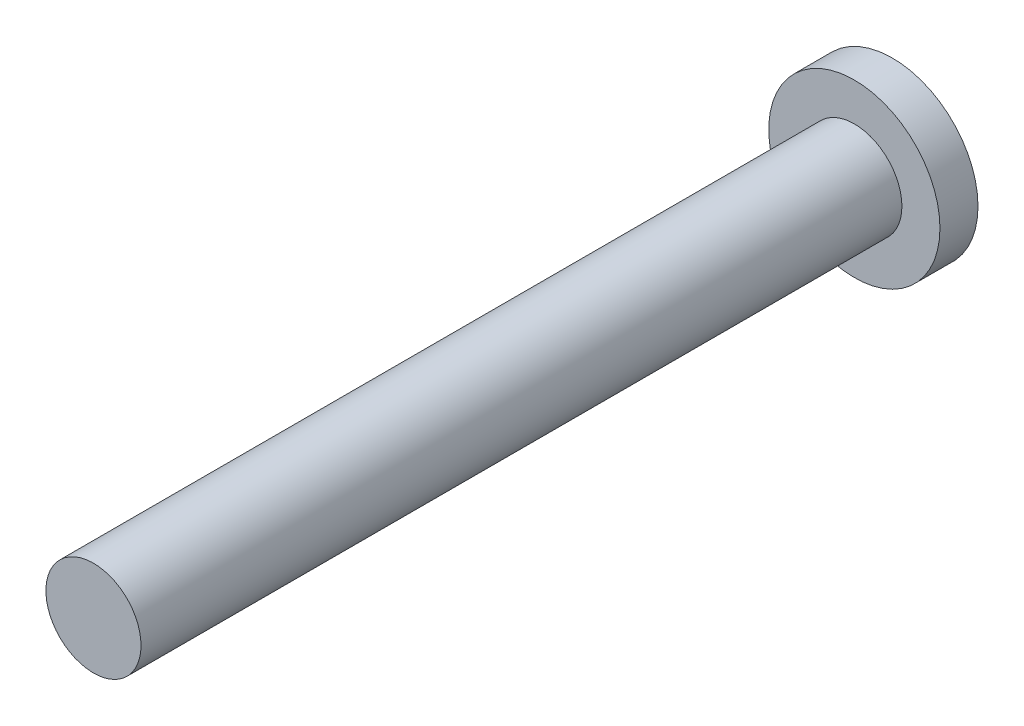
ISO-10303-21;
HEADER;
FILE_DESCRIPTION(('STEP AP214'),'2;1');
FILE_NAME('part.step','',(''),(''),'','','');
FILE_SCHEMA(('AUTOMOTIVE_DESIGN { 1 0 10303 214 1 1 1 1 }'));
ENDSEC;
DATA;
#1=APPLICATION_CONTEXT('core data for automotive mechanical design processes');
#2=APPLICATION_PROTOCOL_DEFINITION('international standard','automotive_design',2000,#1);
#3=PRODUCT_CONTEXT('',#1,'mechanical');
#4=PRODUCT('Part','Part','',(#3));
#5=PRODUCT_RELATED_PRODUCT_CATEGORY('part','',(#4));
#6=PRODUCT_DEFINITION_FORMATION('','',#4);
#7=PRODUCT_DEFINITION_CONTEXT('part definition',#1,'design');
#8=PRODUCT_DEFINITION('design','',#6,#7);
#9=PRODUCT_DEFINITION_SHAPE('','',#8);
#10=(LENGTH_UNIT() NAMED_UNIT(*) SI_UNIT(.MILLI.,.METRE.));
#11=(NAMED_UNIT(*) PLANE_ANGLE_UNIT() SI_UNIT($,.RADIAN.));
#12=(NAMED_UNIT(*) SI_UNIT($,.STERADIAN.) SOLID_ANGLE_UNIT());
#13=UNCERTAINTY_MEASURE_WITH_UNIT(LENGTH_MEASURE(1.E-05),#10,'distance_accuracy_value','');
#14=(GEOMETRIC_REPRESENTATION_CONTEXT(3) GLOBAL_UNCERTAINTY_ASSIGNED_CONTEXT((#13)) GLOBAL_UNIT_ASSIGNED_CONTEXT((#10,
#11,#12)) REPRESENTATION_CONTEXT('',''));
#15=CARTESIAN_POINT('',(0.,0.,0.));
#16=DIRECTION('',(0.,0.,1.));
#17=DIRECTION('',(1.,0.,0.));
#18=AXIS2_PLACEMENT_3D('',#15,#16,#17);
#19=CARTESIAN_POINT('',(0.,0.,-40.));
#20=DIRECTION('',(0.,0.,1.));
#21=DIRECTION('',(-1.,0.,0.));
#22=AXIS2_PLACEMENT_3D('',#19,#20,#21);
#23=CYLINDRICAL_SURFACE('',#22,2.5);
#24=CARTESIAN_POINT('',(0.,0.,-40.));
#25=DIRECTION('',(0.,0.,1.));
#26=DIRECTION('',(1.,0.,0.));
#27=AXIS2_PLACEMENT_3D('',#24,#25,#26);
#28=CIRCLE('',#27,2.5);
#29=CARTESIAN_POINT('',(2.5,0.,-40.));
#30=VERTEX_POINT('',#29);
#31=EDGE_CURVE('E10',#30,#30,#28,.T.);
#32=ORIENTED_EDGE('',*,*,#31,.T.);
#33=EDGE_LOOP('',(#32));
#34=FACE_BOUND('',#33,.T.);
#35=CARTESIAN_POINT('',(0.,0.,0.));
#36=DIRECTION('',(0.,0.,1.));
#37=DIRECTION('',(1.,0.,0.));
#38=AXIS2_PLACEMENT_3D('',#35,#36,#37);
#39=CIRCLE('',#38,2.5);
#40=CARTESIAN_POINT('',(2.5,0.,0.));
#41=VERTEX_POINT('',#40);
#42=EDGE_CURVE('E36',#41,#41,#39,.T.);
#43=ORIENTED_EDGE('',*,*,#42,.F.);
#44=EDGE_LOOP('',(#43));
#45=FACE_BOUND('',#44,.T.);
#46=ADVANCED_FACE('F33',(#34,#45),#23,.T.);
#47=CARTESIAN_POINT('',(0.,0.,0.));
#48=DIRECTION('',(0.,0.,-1.));
#49=DIRECTION('',(1.,0.,0.));
#50=AXIS2_PLACEMENT_3D('',#47,#48,#49);
#51=PLANE('',#50);
#52=ORIENTED_EDGE('',*,*,#42,.T.);
#53=EDGE_LOOP('',(#52));
#54=FACE_BOUND('',#53,.T.);
#55=ADVANCED_FACE('F64',(#54),#51,.F.);
#56=CARTESIAN_POINT('',(0.,0.,-42.));
#57=DIRECTION('',(0.,0.,1.));
#58=DIRECTION('',(-1.,0.,0.));
#59=AXIS2_PLACEMENT_3D('',#56,#57,#58);
#60=CYLINDRICAL_SURFACE('',#59,4.5);
#61=CARTESIAN_POINT('',(0.,0.,-42.));
#62=DIRECTION('',(0.,0.,1.));
#63=DIRECTION('',(1.,0.,0.));
#64=AXIS2_PLACEMENT_3D('',#61,#62,#63);
#65=CIRCLE('',#64,4.5);
#66=CARTESIAN_POINT('',(4.5,0.,-42.));
#67=VERTEX_POINT('',#66);
#68=EDGE_CURVE('E43',#67,#67,#65,.T.);
#69=ORIENTED_EDGE('',*,*,#68,.T.);
#70=EDGE_LOOP('',(#69));
#71=FACE_BOUND('',#70,.T.);
#72=CARTESIAN_POINT('',(0.,0.,-40.));
#73=DIRECTION('',(0.,0.,1.));
#74=DIRECTION('',(1.,0.,0.));
#75=AXIS2_PLACEMENT_3D('',#72,#73,#74);
#76=CIRCLE('',#75,4.5);
#77=CARTESIAN_POINT('',(4.5,0.,-40.));
#78=VERTEX_POINT('',#77);
#79=EDGE_CURVE('E45',#78,#78,#76,.T.);
#80=ORIENTED_EDGE('',*,*,#79,.F.);
#81=EDGE_LOOP('',(#80));
#82=FACE_BOUND('',#81,.T.);
#83=ADVANCED_FACE('F51',(#71,#82),#60,.T.);
#84=CARTESIAN_POINT('',(0.,0.,-42.));
#85=DIRECTION('',(0.,0.,-1.));
#86=DIRECTION('',(1.,0.,0.));
#87=AXIS2_PLACEMENT_3D('',#84,#85,#86);
#88=PLANE('',#87);
#89=ORIENTED_EDGE('',*,*,#68,.F.);
#90=EDGE_LOOP('',(#89));
#91=FACE_BOUND('',#90,.T.);
#92=ADVANCED_FACE('F54',(#91),#88,.T.);
#93=CARTESIAN_POINT('',(0.,0.,-40.));
#94=DIRECTION('',(0.,0.,-1.));
#95=DIRECTION('',(1.,0.,0.));
#96=AXIS2_PLACEMENT_3D('',#93,#94,#95);
#97=PLANE('',#96);
#98=ORIENTED_EDGE('',*,*,#31,.F.);
#99=EDGE_LOOP('',(#98));
#100=FACE_BOUND('',#99,.T.);
#101=ORIENTED_EDGE('',*,*,#79,.T.);
#102=EDGE_LOOP('',(#101));
#103=FACE_BOUND('',#102,.T.);
#104=ADVANCED_FACE('F56',(#100,#103),#97,.F.);
#105=CLOSED_SHELL('',(#46,#55,#83,#92,#104));
#106=MANIFOLD_SOLID_BREP('B2',#105);
#107=ADVANCED_BREP_SHAPE_REPRESENTATION('',(#18,#106),#14);
#108=SHAPE_DEFINITION_REPRESENTATION(#9,#107);
ENDSEC;
END-ISO-10303-21;
